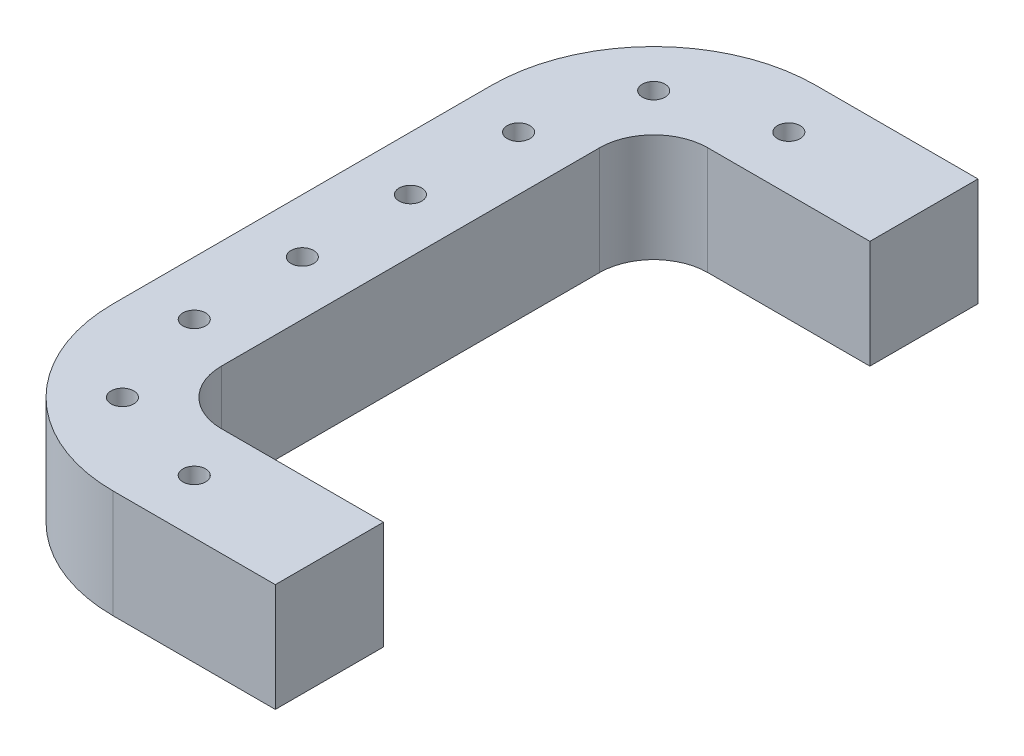
ISO-10303-21;
HEADER;
FILE_DESCRIPTION(('STEP AP214'),'2;1');
FILE_NAME('part.step','',(''),(''),'','','');
FILE_SCHEMA(('AUTOMOTIVE_DESIGN { 1 0 10303 214 1 1 1 1 }'));
ENDSEC;
DATA;
#1=APPLICATION_CONTEXT('core data for automotive mechanical design processes');
#2=APPLICATION_PROTOCOL_DEFINITION('international standard','automotive_design',2000,#1);
#3=PRODUCT_CONTEXT('',#1,'mechanical');
#4=PRODUCT('Part','Part','',(#3));
#5=PRODUCT_RELATED_PRODUCT_CATEGORY('part','',(#4));
#6=PRODUCT_DEFINITION_FORMATION('','',#4);
#7=PRODUCT_DEFINITION_CONTEXT('part definition',#1,'design');
#8=PRODUCT_DEFINITION('design','',#6,#7);
#9=PRODUCT_DEFINITION_SHAPE('','',#8);
#10=(LENGTH_UNIT() NAMED_UNIT(*) SI_UNIT(.MILLI.,.METRE.));
#11=(NAMED_UNIT(*) PLANE_ANGLE_UNIT() SI_UNIT($,.RADIAN.));
#12=(NAMED_UNIT(*) SI_UNIT($,.STERADIAN.) SOLID_ANGLE_UNIT());
#13=UNCERTAINTY_MEASURE_WITH_UNIT(LENGTH_MEASURE(1.E-05),#10,'distance_accuracy_value','');
#14=(GEOMETRIC_REPRESENTATION_CONTEXT(3) GLOBAL_UNCERTAINTY_ASSIGNED_CONTEXT((#13)) GLOBAL_UNIT_ASSIGNED_CONTEXT((#10,
#11,#12)) REPRESENTATION_CONTEXT('',''));
#15=CARTESIAN_POINT('',(0.,0.,0.));
#16=DIRECTION('',(0.,0.,1.));
#17=DIRECTION('',(1.,0.,0.));
#18=AXIS2_PLACEMENT_3D('',#15,#16,#17);
#19=CARTESIAN_POINT('',(10.,10.,0.));
#20=DIRECTION('',(-1.,0.,0.));
#21=DIRECTION('',(0.,0.,1.));
#22=AXIS2_PLACEMENT_3D('',#19,#20,#21);
#23=PLANE('',#22);
#24=DIRECTION('',(0.,0.,-1.));
#25=VECTOR('',#24,1.);
#26=CARTESIAN_POINT('',(10.,-10.,0.));
#27=LINE('',#26,#25);
#28=CARTESIAN_POINT('',(10.,-10.,40.));
#29=VERTEX_POINT('',#28);
#30=CARTESIAN_POINT('',(10.,-10.,-30.));
#31=VERTEX_POINT('',#30);
#32=EDGE_CURVE('E125',#29,#31,#27,.T.);
#33=ORIENTED_EDGE('',*,*,#32,.T.);
#34=DIRECTION('',(0.,-1.,0.));
#35=VECTOR('',#34,1.);
#36=CARTESIAN_POINT('',(10.,10.,-30.));
#37=LINE('',#36,#35);
#38=CARTESIAN_POINT('',(10.,10.,-30.));
#39=VERTEX_POINT('',#38);
#40=EDGE_CURVE('E11',#39,#31,#37,.T.);
#41=ORIENTED_EDGE('',*,*,#40,.F.);
#42=DIRECTION('',(0.,0.,-1.));
#43=VECTOR('',#42,1.);
#44=CARTESIAN_POINT('',(10.,10.,0.));
#45=LINE('',#44,#43);
#46=CARTESIAN_POINT('',(10.,10.,40.));
#47=VERTEX_POINT('',#46);
#48=EDGE_CURVE('E87',#47,#39,#45,.T.);
#49=ORIENTED_EDGE('',*,*,#48,.F.);
#50=DIRECTION('',(0.,-1.,0.));
#51=VECTOR('',#50,1.);
#52=CARTESIAN_POINT('',(10.,10.,40.));
#53=LINE('',#52,#51);
#54=EDGE_CURVE('E189',#47,#29,#53,.T.);
#55=ORIENTED_EDGE('',*,*,#54,.T.);
#56=EDGE_LOOP('',(#33,#41,#49,#55));
#57=FACE_BOUND('',#56,.T.);
#58=ADVANCED_FACE('F33',(#57),#23,.F.);
#59=CARTESIAN_POINT('',(20.,10.,-30.));
#60=DIRECTION('',(0.,-1.,0.));
#61=DIRECTION('',(0.,0.,-1.));
#62=AXIS2_PLACEMENT_3D('',#59,#60,#61);
#63=CYLINDRICAL_SURFACE('',#62,10.);
#64=CARTESIAN_POINT('',(20.,-10.,-30.));
#65=DIRECTION('',(0.,-1.,0.));
#66=DIRECTION('',(0.,0.,-1.));
#67=AXIS2_PLACEMENT_3D('',#64,#65,#66);
#68=CIRCLE('',#67,10.);
#69=CARTESIAN_POINT('',(20.,-10.,-40.));
#70=VERTEX_POINT('',#69);
#71=EDGE_CURVE('E127',#31,#70,#68,.T.);
#72=ORIENTED_EDGE('',*,*,#71,.T.);
#73=DIRECTION('',(0.,-1.,0.));
#74=VECTOR('',#73,1.);
#75=CARTESIAN_POINT('',(20.,10.,-40.));
#76=LINE('',#75,#74);
#77=CARTESIAN_POINT('',(20.,10.,-40.));
#78=VERTEX_POINT('',#77);
#79=EDGE_CURVE('E41',#78,#70,#76,.T.);
#80=ORIENTED_EDGE('',*,*,#79,.F.);
#81=CARTESIAN_POINT('',(20.,10.,-30.));
#82=DIRECTION('',(0.,-1.,0.));
#83=DIRECTION('',(0.,0.,-1.));
#84=AXIS2_PLACEMENT_3D('',#81,#82,#83);
#85=CIRCLE('',#84,10.);
#86=EDGE_CURVE('E216',#39,#78,#85,.T.);
#87=ORIENTED_EDGE('',*,*,#86,.F.);
#88=ORIENTED_EDGE('',*,*,#40,.T.);
#89=EDGE_LOOP('',(#72,#80,#87,#88));
#90=FACE_BOUND('',#89,.T.);
#91=ADVANCED_FACE('F217',(#90),#63,.F.);
#92=CARTESIAN_POINT('',(20.,10.,-40.));
#93=DIRECTION('',(0.,0.,-1.));
#94=DIRECTION('',(-1.,0.,0.));
#95=AXIS2_PLACEMENT_3D('',#92,#93,#94);
#96=PLANE('',#95);
#97=DIRECTION('',(1.,0.,0.));
#98=VECTOR('',#97,1.);
#99=CARTESIAN_POINT('',(20.,-10.,-40.));
#100=LINE('',#99,#98);
#101=CARTESIAN_POINT('',(50.,-10.,-40.));
#102=VERTEX_POINT('',#101);
#103=EDGE_CURVE('E130',#70,#102,#100,.T.);
#104=ORIENTED_EDGE('',*,*,#103,.T.);
#105=DIRECTION('',(0.,-1.,0.));
#106=VECTOR('',#105,1.);
#107=CARTESIAN_POINT('',(50.,10.,-40.));
#108=LINE('',#107,#106);
#109=CARTESIAN_POINT('',(50.,10.,-40.));
#110=VERTEX_POINT('',#109);
#111=EDGE_CURVE('E114',#110,#102,#108,.T.);
#112=ORIENTED_EDGE('',*,*,#111,.F.);
#113=DIRECTION('',(1.,0.,0.));
#114=VECTOR('',#113,1.);
#115=CARTESIAN_POINT('',(20.,10.,-40.));
#116=LINE('',#115,#114);
#117=EDGE_CURVE('E105',#78,#110,#116,.T.);
#118=ORIENTED_EDGE('',*,*,#117,.F.);
#119=ORIENTED_EDGE('',*,*,#79,.T.);
#120=EDGE_LOOP('',(#104,#112,#118,#119));
#121=FACE_BOUND('',#120,.T.);
#122=ADVANCED_FACE('F144',(#121),#96,.F.);
#123=CARTESIAN_POINT('',(50.,10.,-40.));
#124=DIRECTION('',(-1.,0.,0.));
#125=DIRECTION('',(0.,0.,1.));
#126=AXIS2_PLACEMENT_3D('',#123,#124,#125);
#127=PLANE('',#126);
#128=DIRECTION('',(0.,0.,-1.));
#129=VECTOR('',#128,1.);
#130=CARTESIAN_POINT('',(50.,-10.,-40.));
#131=LINE('',#130,#129);
#132=CARTESIAN_POINT('',(50.,-10.,-60.));
#133=VERTEX_POINT('',#132);
#134=EDGE_CURVE('E113',#102,#133,#131,.T.);
#135=ORIENTED_EDGE('',*,*,#134,.T.);
#136=DIRECTION('',(0.,-1.,0.));
#137=VECTOR('',#136,1.);
#138=CARTESIAN_POINT('',(50.,10.,-60.));
#139=LINE('',#138,#137);
#140=CARTESIAN_POINT('',(50.,10.,-60.));
#141=VERTEX_POINT('',#140);
#142=EDGE_CURVE('E110',#141,#133,#139,.T.);
#143=ORIENTED_EDGE('',*,*,#142,.F.);
#144=DIRECTION('',(0.,0.,-1.));
#145=VECTOR('',#144,1.);
#146=CARTESIAN_POINT('',(50.,10.,-40.));
#147=LINE('',#146,#145);
#148=EDGE_CURVE('E98',#110,#141,#147,.T.);
#149=ORIENTED_EDGE('',*,*,#148,.F.);
#150=ORIENTED_EDGE('',*,*,#111,.T.);
#151=EDGE_LOOP('',(#135,#143,#149,#150));
#152=FACE_BOUND('',#151,.T.);
#153=ADVANCED_FACE('F111',(#152),#127,.F.);
#154=CARTESIAN_POINT('',(20.,10.,-60.));
#155=DIRECTION('',(0.,0.,1.));
#156=DIRECTION('',(1.,0.,0.));
#157=AXIS2_PLACEMENT_3D('',#154,#155,#156);
#158=PLANE('',#157);
#159=DIRECTION('',(-1.,0.,0.));
#160=VECTOR('',#159,1.);
#161=CARTESIAN_POINT('',(20.,-10.,-60.));
#162=LINE('',#161,#160);
#163=CARTESIAN_POINT('',(20.,-10.,-60.));
#164=VERTEX_POINT('',#163);
#165=EDGE_CURVE('E73',#133,#164,#162,.T.);
#166=ORIENTED_EDGE('',*,*,#165,.T.);
#167=DIRECTION('',(0.,-1.,0.));
#168=VECTOR('',#167,1.);
#169=CARTESIAN_POINT('',(20.,10.,-60.));
#170=LINE('',#169,#168);
#171=CARTESIAN_POINT('',(20.,10.,-60.));
#172=VERTEX_POINT('',#171);
#173=EDGE_CURVE('E115',#172,#164,#170,.T.);
#174=ORIENTED_EDGE('',*,*,#173,.F.);
#175=DIRECTION('',(-1.,0.,0.));
#176=VECTOR('',#175,1.);
#177=CARTESIAN_POINT('',(20.,10.,-60.));
#178=LINE('',#177,#176);
#179=EDGE_CURVE('E103',#141,#172,#178,.T.);
#180=ORIENTED_EDGE('',*,*,#179,.F.);
#181=ORIENTED_EDGE('',*,*,#142,.T.);
#182=EDGE_LOOP('',(#166,#174,#180,#181));
#183=FACE_BOUND('',#182,.T.);
#184=ADVANCED_FACE('F117',(#183),#158,.F.);
#185=CARTESIAN_POINT('',(20.,10.,-30.));
#186=DIRECTION('',(0.,-1.,0.));
#187=DIRECTION('',(0.,0.,-1.));
#188=AXIS2_PLACEMENT_3D('',#185,#186,#187);
#189=CYLINDRICAL_SURFACE('',#188,30.);
#190=CARTESIAN_POINT('',(20.,-10.,-30.));
#191=DIRECTION('',(0.,1.,0.));
#192=DIRECTION('',(0.,0.,-1.));
#193=AXIS2_PLACEMENT_3D('',#190,#191,#192);
#194=CIRCLE('',#193,30.);
#195=CARTESIAN_POINT('',(-10.,-10.,-30.));
#196=VERTEX_POINT('',#195);
#197=EDGE_CURVE('E79',#164,#196,#194,.T.);
#198=ORIENTED_EDGE('',*,*,#197,.T.);
#199=DIRECTION('',(0.,-1.,0.));
#200=VECTOR('',#199,1.);
#201=CARTESIAN_POINT('',(-10.,10.,-30.));
#202=LINE('',#201,#200);
#203=CARTESIAN_POINT('',(-10.,10.,-30.));
#204=VERTEX_POINT('',#203);
#205=EDGE_CURVE('E124',#204,#196,#202,.T.);
#206=ORIENTED_EDGE('',*,*,#205,.F.);
#207=CARTESIAN_POINT('',(20.,10.,-30.));
#208=DIRECTION('',(0.,1.,0.));
#209=DIRECTION('',(0.,0.,-1.));
#210=AXIS2_PLACEMENT_3D('',#207,#208,#209);
#211=CIRCLE('',#210,30.);
#212=EDGE_CURVE('E49',#172,#204,#211,.T.);
#213=ORIENTED_EDGE('',*,*,#212,.F.);
#214=ORIENTED_EDGE('',*,*,#173,.T.);
#215=EDGE_LOOP('',(#198,#206,#213,#214));
#216=FACE_BOUND('',#215,.T.);
#217=ADVANCED_FACE('F304',(#216),#189,.T.);
#218=CARTESIAN_POINT('',(-10.,10.,0.));
#219=DIRECTION('',(1.,0.,0.));
#220=DIRECTION('',(0.,0.,-1.));
#221=AXIS2_PLACEMENT_3D('',#218,#219,#220);
#222=PLANE('',#221);
#223=DIRECTION('',(0.,0.,1.));
#224=VECTOR('',#223,1.);
#225=CARTESIAN_POINT('',(-10.,-10.,0.));
#226=LINE('',#225,#224);
#227=CARTESIAN_POINT('',(-9.99999999999999,-10.,40.));
#228=VERTEX_POINT('',#227);
#229=EDGE_CURVE('E135',#196,#228,#226,.T.);
#230=ORIENTED_EDGE('',*,*,#229,.T.);
#231=DIRECTION('',(0.,-1.,0.));
#232=VECTOR('',#231,1.);
#233=CARTESIAN_POINT('',(-9.99999999999999,10.,40.));
#234=LINE('',#233,#232);
#235=CARTESIAN_POINT('',(-9.99999999999999,10.,40.));
#236=VERTEX_POINT('',#235);
#237=EDGE_CURVE('E162',#236,#228,#234,.T.);
#238=ORIENTED_EDGE('',*,*,#237,.F.);
#239=DIRECTION('',(0.,0.,1.));
#240=VECTOR('',#239,1.);
#241=CARTESIAN_POINT('',(-10.,10.,0.));
#242=LINE('',#241,#240);
#243=EDGE_CURVE('E119',#204,#236,#242,.T.);
#244=ORIENTED_EDGE('',*,*,#243,.F.);
#245=ORIENTED_EDGE('',*,*,#205,.T.);
#246=EDGE_LOOP('',(#230,#238,#244,#245));
#247=FACE_BOUND('',#246,.T.);
#248=ADVANCED_FACE('F160',(#247),#222,.F.);
#249=CARTESIAN_POINT('',(20.,10.,-30.));
#250=DIRECTION('',(0.,-1.,0.));
#251=DIRECTION('',(0.,0.,-1.));
#252=AXIS2_PLACEMENT_3D('',#249,#250,#251);
#253=PLANE('',#252);
#254=CARTESIAN_POINT('',(0.,10.,-5.));
#255=DIRECTION('',(0.,1.,0.));
#256=DIRECTION('',(0.,0.,1.));
#257=AXIS2_PLACEMENT_3D('',#254,#255,#256);
#258=CIRCLE('',#257,2.1);
#259=CARTESIAN_POINT('',(0.,10.,-2.9));
#260=VERTEX_POINT('',#259);
#261=EDGE_CURVE('E192',#260,#260,#258,.T.);
#262=ORIENTED_EDGE('',*,*,#261,.F.);
#263=EDGE_LOOP('',(#262));
#264=FACE_BOUND('',#263,.T.);
#265=CARTESIAN_POINT('',(25.,10.,-50.));
#266=DIRECTION('',(0.,1.,0.));
#267=DIRECTION('',(0.,0.,-1.));
#268=AXIS2_PLACEMENT_3D('',#265,#266,#267);
#269=CIRCLE('',#268,2.1);
#270=CARTESIAN_POINT('',(25.,10.,-52.1));
#271=VERTEX_POINT('',#270);
#272=EDGE_CURVE('E203',#271,#271,#269,.T.);
#273=ORIENTED_EDGE('',*,*,#272,.F.);
#274=EDGE_LOOP('',(#273));
#275=FACE_BOUND('',#274,.T.);
#276=CARTESIAN_POINT('',(0.,10.,-25.));
#277=DIRECTION('',(0.,1.,0.));
#278=DIRECTION('',(0.,0.,1.));
#279=AXIS2_PLACEMENT_3D('',#276,#277,#278);
#280=CIRCLE('',#279,2.1);
#281=CARTESIAN_POINT('',(0.,10.,-22.9));
#282=VERTEX_POINT('',#281);
#283=EDGE_CURVE('E197',#282,#282,#280,.T.);
#284=ORIENTED_EDGE('',*,*,#283,.F.);
#285=EDGE_LOOP('',(#284));
#286=FACE_BOUND('',#285,.T.);
#287=CARTESIAN_POINT('',(5.85786437626905,10.,-44.142135623731));
#288=DIRECTION('',(0.,1.,0.));
#289=DIRECTION('',(0.,0.,1.));
#290=AXIS2_PLACEMENT_3D('',#287,#288,#289);
#291=CIRCLE('',#290,2.1);
#292=CARTESIAN_POINT('',(5.85786437626905,10.,-42.0421356237309));
#293=VERTEX_POINT('',#292);
#294=EDGE_CURVE('E196',#293,#293,#291,.T.);
#295=ORIENTED_EDGE('',*,*,#294,.F.);
#296=EDGE_LOOP('',(#295));
#297=FACE_BOUND('',#296,.T.);
#298=ORIENTED_EDGE('',*,*,#243,.T.);
#299=CARTESIAN_POINT('',(20.,10.,40.));
#300=DIRECTION('',(0.,-1.,0.));
#301=DIRECTION('',(0.,0.,1.));
#302=AXIS2_PLACEMENT_3D('',#299,#300,#301);
#303=CIRCLE('',#302,30.);
#304=CARTESIAN_POINT('',(20.,10.,70.));
#305=VERTEX_POINT('',#304);
#306=EDGE_CURVE('E171',#305,#236,#303,.T.);
#307=ORIENTED_EDGE('',*,*,#306,.F.);
#308=DIRECTION('',(-1.,0.,0.));
#309=VECTOR('',#308,1.);
#310=CARTESIAN_POINT('',(20.,10.,70.));
#311=LINE('',#310,#309);
#312=CARTESIAN_POINT('',(50.,10.,70.));
#313=VERTEX_POINT('',#312);
#314=EDGE_CURVE('E176',#313,#305,#311,.T.);
#315=ORIENTED_EDGE('',*,*,#314,.F.);
#316=DIRECTION('',(0.,0.,1.));
#317=VECTOR('',#316,1.);
#318=CARTESIAN_POINT('',(50.,10.,50.));
#319=LINE('',#318,#317);
#320=CARTESIAN_POINT('',(50.,10.,50.));
#321=VERTEX_POINT('',#320);
#322=EDGE_CURVE('E249',#321,#313,#319,.T.);
#323=ORIENTED_EDGE('',*,*,#322,.F.);
#324=DIRECTION('',(1.,0.,0.));
#325=VECTOR('',#324,1.);
#326=CARTESIAN_POINT('',(20.,10.,50.));
#327=LINE('',#326,#325);
#328=CARTESIAN_POINT('',(20.,10.,50.));
#329=VERTEX_POINT('',#328);
#330=EDGE_CURVE('E245',#329,#321,#327,.T.);
#331=ORIENTED_EDGE('',*,*,#330,.F.);
#332=CARTESIAN_POINT('',(20.,10.,40.));
#333=DIRECTION('',(0.,1.,0.));
#334=DIRECTION('',(0.,0.,1.));
#335=AXIS2_PLACEMENT_3D('',#332,#333,#334);
#336=CIRCLE('',#335,10.);
#337=EDGE_CURVE('E244',#47,#329,#336,.T.);
#338=ORIENTED_EDGE('',*,*,#337,.F.);
#339=ORIENTED_EDGE('',*,*,#48,.T.);
#340=ORIENTED_EDGE('',*,*,#86,.T.);
#341=ORIENTED_EDGE('',*,*,#117,.T.);
#342=ORIENTED_EDGE('',*,*,#148,.T.);
#343=ORIENTED_EDGE('',*,*,#179,.T.);
#344=ORIENTED_EDGE('',*,*,#212,.T.);
#345=EDGE_LOOP('',(#298,#307,#315,#323,#331,#338,#339,#340,#341,#342,#343,#344));
#346=FACE_BOUND('',#345,.T.);
#347=CARTESIAN_POINT('',(0.,10.,15.));
#348=DIRECTION('',(0.,-1.,0.));
#349=DIRECTION('',(0.,0.,-1.));
#350=AXIS2_PLACEMENT_3D('',#347,#348,#349);
#351=CIRCLE('',#350,2.1);
#352=CARTESIAN_POINT('',(0.,10.,12.9));
#353=VERTEX_POINT('',#352);
#354=EDGE_CURVE('E439',#353,#353,#351,.T.);
#355=ORIENTED_EDGE('',*,*,#354,.T.);
#356=EDGE_LOOP('',(#355));
#357=FACE_BOUND('',#356,.T.);
#358=CARTESIAN_POINT('',(25.,10.,60.));
#359=DIRECTION('',(0.,-1.,0.));
#360=DIRECTION('',(0.,0.,1.));
#361=AXIS2_PLACEMENT_3D('',#358,#359,#360);
#362=CIRCLE('',#361,2.1);
#363=CARTESIAN_POINT('',(25.,10.,62.1));
#364=VERTEX_POINT('',#363);
#365=EDGE_CURVE('E441',#364,#364,#362,.T.);
#366=ORIENTED_EDGE('',*,*,#365,.T.);
#367=EDGE_LOOP('',(#366));
#368=FACE_BOUND('',#367,.T.);
#369=CARTESIAN_POINT('',(0.,10.,35.));
#370=DIRECTION('',(0.,-1.,0.));
#371=DIRECTION('',(0.,0.,-1.));
#372=AXIS2_PLACEMENT_3D('',#369,#370,#371);
#373=CIRCLE('',#372,2.1);
#374=CARTESIAN_POINT('',(0.,10.,32.9));
#375=VERTEX_POINT('',#374);
#376=EDGE_CURVE('E449',#375,#375,#373,.T.);
#377=ORIENTED_EDGE('',*,*,#376,.T.);
#378=EDGE_LOOP('',(#377));
#379=FACE_BOUND('',#378,.T.);
#380=CARTESIAN_POINT('',(5.85786437626906,10.,54.1421356237309));
#381=DIRECTION('',(0.,-1.,0.));
#382=DIRECTION('',(0.,0.,-1.));
#383=AXIS2_PLACEMENT_3D('',#380,#381,#382);
#384=CIRCLE('',#383,2.1);
#385=CARTESIAN_POINT('',(5.85786437626906,10.,52.0421356237309));
#386=VERTEX_POINT('',#385);
#387=EDGE_CURVE('E237',#386,#386,#384,.T.);
#388=ORIENTED_EDGE('',*,*,#387,.T.);
#389=EDGE_LOOP('',(#388));
#390=FACE_BOUND('',#389,.T.);
#391=ADVANCED_FACE('F100',(#264,#275,#286,#297,#346,#357,#368,#379,#390),#253,.F.);
#392=CARTESIAN_POINT('',(20.,-10.,-30.));
#393=DIRECTION('',(0.,-1.,0.));
#394=DIRECTION('',(0.,0.,-1.));
#395=AXIS2_PLACEMENT_3D('',#392,#393,#394);
#396=PLANE('',#395);
#397=CARTESIAN_POINT('',(0.,-10.,-5.));
#398=DIRECTION('',(0.,1.,0.));
#399=DIRECTION('',(0.,0.,1.));
#400=AXIS2_PLACEMENT_3D('',#397,#398,#399);
#401=CIRCLE('',#400,2.1);
#402=CARTESIAN_POINT('',(0.,-10.,-2.9));
#403=VERTEX_POINT('',#402);
#404=EDGE_CURVE('E206',#403,#403,#401,.T.);
#405=ORIENTED_EDGE('',*,*,#404,.T.);
#406=EDGE_LOOP('',(#405));
#407=FACE_BOUND('',#406,.T.);
#408=CARTESIAN_POINT('',(25.,-10.,-50.));
#409=DIRECTION('',(0.,1.,0.));
#410=DIRECTION('',(0.,0.,-1.));
#411=AXIS2_PLACEMENT_3D('',#408,#409,#410);
#412=CIRCLE('',#411,2.1);
#413=CARTESIAN_POINT('',(25.,-10.,-52.1));
#414=VERTEX_POINT('',#413);
#415=EDGE_CURVE('E200',#414,#414,#412,.T.);
#416=ORIENTED_EDGE('',*,*,#415,.T.);
#417=EDGE_LOOP('',(#416));
#418=FACE_BOUND('',#417,.T.);
#419=CARTESIAN_POINT('',(0.,-10.,-25.));
#420=DIRECTION('',(0.,1.,0.));
#421=DIRECTION('',(0.,0.,1.));
#422=AXIS2_PLACEMENT_3D('',#419,#420,#421);
#423=CIRCLE('',#422,2.1);
#424=CARTESIAN_POINT('',(0.,-10.,-22.9));
#425=VERTEX_POINT('',#424);
#426=EDGE_CURVE('E193',#425,#425,#423,.T.);
#427=ORIENTED_EDGE('',*,*,#426,.T.);
#428=EDGE_LOOP('',(#427));
#429=FACE_BOUND('',#428,.T.);
#430=CARTESIAN_POINT('',(5.85786437626905,-10.,-44.142135623731));
#431=DIRECTION('',(0.,1.,0.));
#432=DIRECTION('',(0.,0.,1.));
#433=AXIS2_PLACEMENT_3D('',#430,#431,#432);
#434=CIRCLE('',#433,2.1);
#435=CARTESIAN_POINT('',(5.85786437626905,-10.,-42.0421356237309));
#436=VERTEX_POINT('',#435);
#437=EDGE_CURVE('E128',#436,#436,#434,.T.);
#438=ORIENTED_EDGE('',*,*,#437,.T.);
#439=EDGE_LOOP('',(#438));
#440=FACE_BOUND('',#439,.T.);
#441=ORIENTED_EDGE('',*,*,#32,.F.);
#442=CARTESIAN_POINT('',(20.,-10.,40.));
#443=DIRECTION('',(0.,1.,0.));
#444=DIRECTION('',(0.,0.,1.));
#445=AXIS2_PLACEMENT_3D('',#442,#443,#444);
#446=CIRCLE('',#445,10.);
#447=CARTESIAN_POINT('',(20.,-10.,50.));
#448=VERTEX_POINT('',#447);
#449=EDGE_CURVE('E225',#29,#448,#446,.T.);
#450=ORIENTED_EDGE('',*,*,#449,.T.);
#451=DIRECTION('',(1.,0.,0.));
#452=VECTOR('',#451,1.);
#453=CARTESIAN_POINT('',(20.,-10.,50.));
#454=LINE('',#453,#452);
#455=CARTESIAN_POINT('',(50.,-10.,50.));
#456=VERTEX_POINT('',#455);
#457=EDGE_CURVE('E231',#448,#456,#454,.T.);
#458=ORIENTED_EDGE('',*,*,#457,.T.);
#459=DIRECTION('',(0.,0.,1.));
#460=VECTOR('',#459,1.);
#461=CARTESIAN_POINT('',(50.,-10.,50.));
#462=LINE('',#461,#460);
#463=CARTESIAN_POINT('',(50.,-10.,70.));
#464=VERTEX_POINT('',#463);
#465=EDGE_CURVE('E234',#456,#464,#462,.T.);
#466=ORIENTED_EDGE('',*,*,#465,.T.);
#467=DIRECTION('',(-1.,0.,0.));
#468=VECTOR('',#467,1.);
#469=CARTESIAN_POINT('',(20.,-10.,70.));
#470=LINE('',#469,#468);
#471=CARTESIAN_POINT('',(20.,-10.,70.));
#472=VERTEX_POINT('',#471);
#473=EDGE_CURVE('E242',#464,#472,#470,.T.);
#474=ORIENTED_EDGE('',*,*,#473,.T.);
#475=CARTESIAN_POINT('',(20.,-10.,40.));
#476=DIRECTION('',(0.,-1.,0.));
#477=DIRECTION('',(0.,0.,1.));
#478=AXIS2_PLACEMENT_3D('',#475,#476,#477);
#479=CIRCLE('',#478,30.);
#480=EDGE_CURVE('E156',#472,#228,#479,.T.);
#481=ORIENTED_EDGE('',*,*,#480,.T.);
#482=ORIENTED_EDGE('',*,*,#229,.F.);
#483=ORIENTED_EDGE('',*,*,#197,.F.);
#484=ORIENTED_EDGE('',*,*,#165,.F.);
#485=ORIENTED_EDGE('',*,*,#134,.F.);
#486=ORIENTED_EDGE('',*,*,#103,.F.);
#487=ORIENTED_EDGE('',*,*,#71,.F.);
#488=EDGE_LOOP('',(#441,#450,#458,#466,#474,#481,#482,#483,#484,#485,#486,#487));
#489=FACE_BOUND('',#488,.T.);
#490=CARTESIAN_POINT('',(0.,-10.,15.));
#491=DIRECTION('',(0.,-1.,0.));
#492=DIRECTION('',(0.,0.,-1.));
#493=AXIS2_PLACEMENT_3D('',#490,#491,#492);
#494=CIRCLE('',#493,2.1);
#495=CARTESIAN_POINT('',(0.,-10.,12.9));
#496=VERTEX_POINT('',#495);
#497=EDGE_CURVE('E436',#496,#496,#494,.T.);
#498=ORIENTED_EDGE('',*,*,#497,.F.);
#499=EDGE_LOOP('',(#498));
#500=FACE_BOUND('',#499,.T.);
#501=CARTESIAN_POINT('',(25.,-10.,60.));
#502=DIRECTION('',(0.,-1.,0.));
#503=DIRECTION('',(0.,0.,1.));
#504=AXIS2_PLACEMENT_3D('',#501,#502,#503);
#505=CIRCLE('',#504,2.1);
#506=CARTESIAN_POINT('',(25.,-10.,62.1));
#507=VERTEX_POINT('',#506);
#508=EDGE_CURVE('E446',#507,#507,#505,.T.);
#509=ORIENTED_EDGE('',*,*,#508,.F.);
#510=EDGE_LOOP('',(#509));
#511=FACE_BOUND('',#510,.T.);
#512=CARTESIAN_POINT('',(0.,-10.,35.));
#513=DIRECTION('',(0.,-1.,0.));
#514=DIRECTION('',(0.,0.,-1.));
#515=AXIS2_PLACEMENT_3D('',#512,#513,#514);
#516=CIRCLE('',#515,2.1);
#517=CARTESIAN_POINT('',(0.,-10.,32.9));
#518=VERTEX_POINT('',#517);
#519=EDGE_CURVE('E452',#518,#518,#516,.T.);
#520=ORIENTED_EDGE('',*,*,#519,.F.);
#521=EDGE_LOOP('',(#520));
#522=FACE_BOUND('',#521,.T.);
#523=CARTESIAN_POINT('',(5.85786437626906,-10.,54.1421356237309));
#524=DIRECTION('',(0.,-1.,0.));
#525=DIRECTION('',(0.,0.,-1.));
#526=AXIS2_PLACEMENT_3D('',#523,#524,#525);
#527=CIRCLE('',#526,2.1);
#528=CARTESIAN_POINT('',(5.85786437626906,-10.,52.0421356237309));
#529=VERTEX_POINT('',#528);
#530=EDGE_CURVE('E232',#529,#529,#527,.T.);
#531=ORIENTED_EDGE('',*,*,#530,.F.);
#532=EDGE_LOOP('',(#531));
#533=FACE_BOUND('',#532,.T.);
#534=ADVANCED_FACE('F150',(#407,#418,#429,#440,#489,#500,#511,#522,#533),#396,.T.);
#535=CARTESIAN_POINT('',(5.85786437626905,-10.,-44.142135623731));
#536=DIRECTION('',(0.,1.,0.));
#537=DIRECTION('',(0.,0.,1.));
#538=AXIS2_PLACEMENT_3D('',#535,#536,#537);
#539=CYLINDRICAL_SURFACE('',#538,2.1);
#540=ORIENTED_EDGE('',*,*,#437,.F.);
#541=EDGE_LOOP('',(#540));
#542=FACE_BOUND('',#541,.T.);
#543=ORIENTED_EDGE('',*,*,#294,.T.);
#544=EDGE_LOOP('',(#543));
#545=FACE_BOUND('',#544,.T.);
#546=ADVANCED_FACE('F311',(#542,#545),#539,.F.);
#547=CARTESIAN_POINT('',(0.,-10.,-25.));
#548=DIRECTION('',(0.,1.,0.));
#549=DIRECTION('',(0.,0.,1.));
#550=AXIS2_PLACEMENT_3D('',#547,#548,#549);
#551=CYLINDRICAL_SURFACE('',#550,2.1);
#552=ORIENTED_EDGE('',*,*,#426,.F.);
#553=EDGE_LOOP('',(#552));
#554=FACE_BOUND('',#553,.T.);
#555=ORIENTED_EDGE('',*,*,#283,.T.);
#556=EDGE_LOOP('',(#555));
#557=FACE_BOUND('',#556,.T.);
#558=ADVANCED_FACE('F318',(#554,#557),#551,.F.);
#559=CARTESIAN_POINT('',(25.,-10.,-50.));
#560=DIRECTION('',(0.,1.,0.));
#561=DIRECTION('',(0.,0.,1.));
#562=AXIS2_PLACEMENT_3D('',#559,#560,#561);
#563=CYLINDRICAL_SURFACE('',#562,2.1);
#564=ORIENTED_EDGE('',*,*,#415,.F.);
#565=EDGE_LOOP('',(#564));
#566=FACE_BOUND('',#565,.T.);
#567=ORIENTED_EDGE('',*,*,#272,.T.);
#568=EDGE_LOOP('',(#567));
#569=FACE_BOUND('',#568,.T.);
#570=ADVANCED_FACE('F322',(#566,#569),#563,.F.);
#571=CARTESIAN_POINT('',(0.,-10.,-5.));
#572=DIRECTION('',(0.,1.,0.));
#573=DIRECTION('',(0.,0.,1.));
#574=AXIS2_PLACEMENT_3D('',#571,#572,#573);
#575=CYLINDRICAL_SURFACE('',#574,2.1);
#576=ORIENTED_EDGE('',*,*,#404,.F.);
#577=EDGE_LOOP('',(#576));
#578=FACE_BOUND('',#577,.T.);
#579=ORIENTED_EDGE('',*,*,#261,.T.);
#580=EDGE_LOOP('',(#579));
#581=FACE_BOUND('',#580,.T.);
#582=ADVANCED_FACE('F289',(#578,#581),#575,.F.);
#583=CARTESIAN_POINT('',(20.,10.,40.));
#584=DIRECTION('',(0.,-1.,0.));
#585=DIRECTION('',(0.,0.,1.));
#586=AXIS2_PLACEMENT_3D('',#583,#584,#585);
#587=CYLINDRICAL_SURFACE('',#586,10.);
#588=ORIENTED_EDGE('',*,*,#449,.F.);
#589=ORIENTED_EDGE('',*,*,#54,.F.);
#590=ORIENTED_EDGE('',*,*,#337,.T.);
#591=DIRECTION('',(0.,-1.,0.));
#592=VECTOR('',#591,1.);
#593=CARTESIAN_POINT('',(20.,10.,50.));
#594=LINE('',#593,#592);
#595=EDGE_CURVE('E186',#329,#448,#594,.T.);
#596=ORIENTED_EDGE('',*,*,#595,.T.);
#597=EDGE_LOOP('',(#588,#589,#590,#596));
#598=FACE_BOUND('',#597,.T.);
#599=ADVANCED_FACE('F228',(#598),#587,.F.);
#600=CARTESIAN_POINT('',(20.,10.,50.));
#601=DIRECTION('',(0.,0.,1.));
#602=DIRECTION('',(-1.,0.,0.));
#603=AXIS2_PLACEMENT_3D('',#600,#601,#602);
#604=PLANE('',#603);
#605=ORIENTED_EDGE('',*,*,#457,.F.);
#606=ORIENTED_EDGE('',*,*,#595,.F.);
#607=ORIENTED_EDGE('',*,*,#330,.T.);
#608=DIRECTION('',(0.,-1.,0.));
#609=VECTOR('',#608,1.);
#610=CARTESIAN_POINT('',(50.,10.,50.));
#611=LINE('',#610,#609);
#612=EDGE_CURVE('E183',#321,#456,#611,.T.);
#613=ORIENTED_EDGE('',*,*,#612,.T.);
#614=EDGE_LOOP('',(#605,#606,#607,#613));
#615=FACE_BOUND('',#614,.T.);
#616=ADVANCED_FACE('F280',(#615),#604,.F.);
#617=CARTESIAN_POINT('',(50.,10.,50.));
#618=DIRECTION('',(-1.,0.,0.));
#619=DIRECTION('',(0.,0.,-1.));
#620=AXIS2_PLACEMENT_3D('',#617,#618,#619);
#621=PLANE('',#620);
#622=ORIENTED_EDGE('',*,*,#465,.F.);
#623=ORIENTED_EDGE('',*,*,#612,.F.);
#624=ORIENTED_EDGE('',*,*,#322,.T.);
#625=DIRECTION('',(0.,-1.,0.));
#626=VECTOR('',#625,1.);
#627=CARTESIAN_POINT('',(50.,10.,70.));
#628=LINE('',#627,#626);
#629=EDGE_CURVE('E174',#313,#464,#628,.T.);
#630=ORIENTED_EDGE('',*,*,#629,.T.);
#631=EDGE_LOOP('',(#622,#623,#624,#630));
#632=FACE_BOUND('',#631,.T.);
#633=ADVANCED_FACE('F278',(#632),#621,.F.);
#634=CARTESIAN_POINT('',(20.,10.,70.));
#635=DIRECTION('',(0.,0.,-1.));
#636=DIRECTION('',(1.,0.,0.));
#637=AXIS2_PLACEMENT_3D('',#634,#635,#636);
#638=PLANE('',#637);
#639=ORIENTED_EDGE('',*,*,#473,.F.);
#640=ORIENTED_EDGE('',*,*,#629,.F.);
#641=ORIENTED_EDGE('',*,*,#314,.T.);
#642=DIRECTION('',(0.,-1.,0.));
#643=VECTOR('',#642,1.);
#644=CARTESIAN_POINT('',(20.,10.,70.));
#645=LINE('',#644,#643);
#646=EDGE_CURVE('E172',#305,#472,#645,.T.);
#647=ORIENTED_EDGE('',*,*,#646,.T.);
#648=EDGE_LOOP('',(#639,#640,#641,#647));
#649=FACE_BOUND('',#648,.T.);
#650=ADVANCED_FACE('F259',(#649),#638,.F.);
#651=CARTESIAN_POINT('',(20.,10.,40.));
#652=DIRECTION('',(0.,-1.,0.));
#653=DIRECTION('',(0.,0.,1.));
#654=AXIS2_PLACEMENT_3D('',#651,#652,#653);
#655=CYLINDRICAL_SURFACE('',#654,30.);
#656=ORIENTED_EDGE('',*,*,#480,.F.);
#657=ORIENTED_EDGE('',*,*,#646,.F.);
#658=ORIENTED_EDGE('',*,*,#306,.T.);
#659=ORIENTED_EDGE('',*,*,#237,.T.);
#660=EDGE_LOOP('',(#656,#657,#658,#659));
#661=FACE_BOUND('',#660,.T.);
#662=ADVANCED_FACE('F167',(#661),#655,.T.);
#663=CARTESIAN_POINT('',(5.85786437626906,-10.,54.1421356237309));
#664=DIRECTION('',(0.,1.,0.));
#665=DIRECTION('',(0.,0.,-1.));
#666=AXIS2_PLACEMENT_3D('',#663,#664,#665);
#667=CYLINDRICAL_SURFACE('',#666,2.1);
#668=ORIENTED_EDGE('',*,*,#530,.T.);
#669=EDGE_LOOP('',(#668));
#670=FACE_BOUND('',#669,.T.);
#671=ORIENTED_EDGE('',*,*,#387,.F.);
#672=EDGE_LOOP('',(#671));
#673=FACE_BOUND('',#672,.T.);
#674=ADVANCED_FACE('F390',(#670,#673),#667,.F.);
#675=CARTESIAN_POINT('',(0.,-10.,35.));
#676=DIRECTION('',(0.,1.,0.));
#677=DIRECTION('',(0.,0.,-1.));
#678=AXIS2_PLACEMENT_3D('',#675,#676,#677);
#679=CYLINDRICAL_SURFACE('',#678,2.1);
#680=ORIENTED_EDGE('',*,*,#519,.T.);
#681=EDGE_LOOP('',(#680));
#682=FACE_BOUND('',#681,.T.);
#683=ORIENTED_EDGE('',*,*,#376,.F.);
#684=EDGE_LOOP('',(#683));
#685=FACE_BOUND('',#684,.T.);
#686=ADVANCED_FACE('F399',(#682,#685),#679,.F.);
#687=CARTESIAN_POINT('',(25.,-10.,60.));
#688=DIRECTION('',(0.,1.,0.));
#689=DIRECTION('',(0.,0.,-1.));
#690=AXIS2_PLACEMENT_3D('',#687,#688,#689);
#691=CYLINDRICAL_SURFACE('',#690,2.1);
#692=ORIENTED_EDGE('',*,*,#508,.T.);
#693=EDGE_LOOP('',(#692));
#694=FACE_BOUND('',#693,.T.);
#695=ORIENTED_EDGE('',*,*,#365,.F.);
#696=EDGE_LOOP('',(#695));
#697=FACE_BOUND('',#696,.T.);
#698=ADVANCED_FACE('F409',(#694,#697),#691,.F.);
#699=CARTESIAN_POINT('',(0.,-10.,15.));
#700=DIRECTION('',(0.,1.,0.));
#701=DIRECTION('',(0.,0.,-1.));
#702=AXIS2_PLACEMENT_3D('',#699,#700,#701);
#703=CYLINDRICAL_SURFACE('',#702,2.1);
#704=ORIENTED_EDGE('',*,*,#497,.T.);
#705=EDGE_LOOP('',(#704));
#706=FACE_BOUND('',#705,.T.);
#707=ORIENTED_EDGE('',*,*,#354,.F.);
#708=EDGE_LOOP('',(#707));
#709=FACE_BOUND('',#708,.T.);
#710=ADVANCED_FACE('F419',(#706,#709),#703,.F.);
#711=CLOSED_SHELL('',(#58,#91,#122,#153,#184,#217,#248,#391,#534,#546,#558,#570,#582,#599,#616,
#633,#650,#662,#674,#686,#698,#710));
#712=MANIFOLD_SOLID_BREP('B2',#711);
#713=ADVANCED_BREP_SHAPE_REPRESENTATION('',(#18,#712),#14);
#714=SHAPE_DEFINITION_REPRESENTATION(#9,#713);
ENDSEC;
END-ISO-10303-21;
